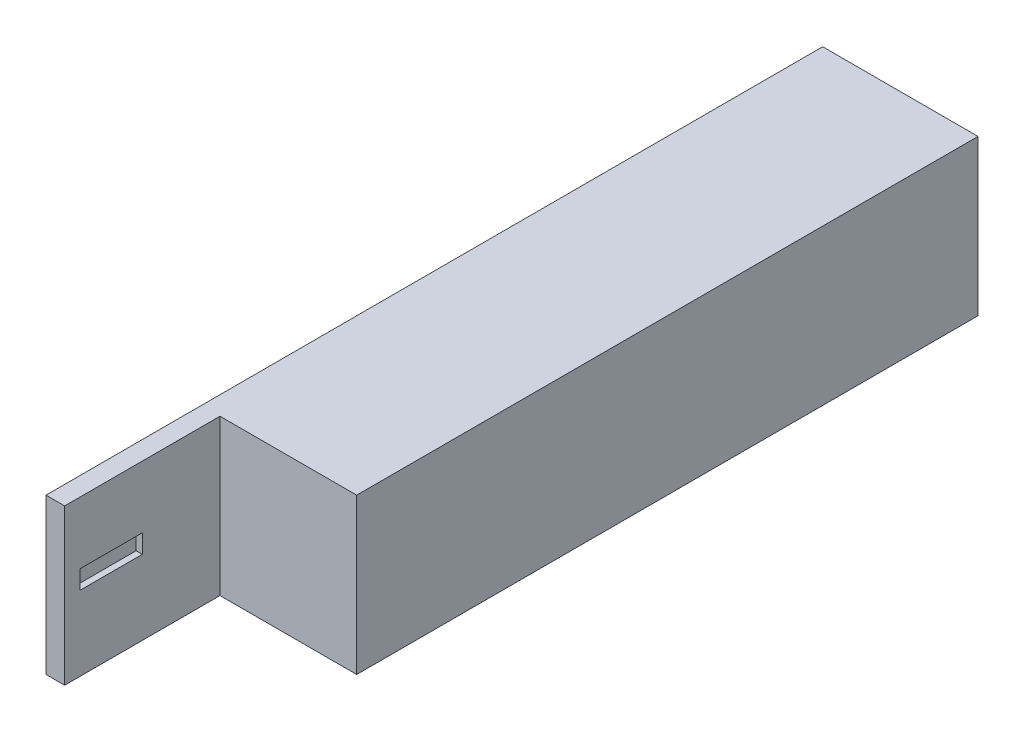
ISO-10303-21;
HEADER;
FILE_DESCRIPTION(('STEP AP214'),'2;1');
FILE_NAME('part.step','',(''),(''),'','','');
FILE_SCHEMA(('AUTOMOTIVE_DESIGN { 1 0 10303 214 1 1 1 1 }'));
ENDSEC;
DATA;
#1=APPLICATION_CONTEXT('core data for automotive mechanical design processes');
#2=APPLICATION_PROTOCOL_DEFINITION('international standard','automotive_design',2000,#1);
#3=PRODUCT_CONTEXT('',#1,'mechanical');
#4=PRODUCT('Part','Part','',(#3));
#5=PRODUCT_RELATED_PRODUCT_CATEGORY('part','',(#4));
#6=PRODUCT_DEFINITION_FORMATION('','',#4);
#7=PRODUCT_DEFINITION_CONTEXT('part definition',#1,'design');
#8=PRODUCT_DEFINITION('design','',#6,#7);
#9=PRODUCT_DEFINITION_SHAPE('','',#8);
#10=(LENGTH_UNIT() NAMED_UNIT(*) SI_UNIT(.MILLI.,.METRE.));
#11=(NAMED_UNIT(*) PLANE_ANGLE_UNIT() SI_UNIT($,.RADIAN.));
#12=(NAMED_UNIT(*) SI_UNIT($,.STERADIAN.) SOLID_ANGLE_UNIT());
#13=UNCERTAINTY_MEASURE_WITH_UNIT(LENGTH_MEASURE(1.E-05),#10,'distance_accuracy_value','');
#14=(GEOMETRIC_REPRESENTATION_CONTEXT(3) GLOBAL_UNCERTAINTY_ASSIGNED_CONTEXT((#13)) GLOBAL_UNIT_ASSIGNED_CONTEXT((#10,
#11,#12)) REPRESENTATION_CONTEXT('',''));
#15=CARTESIAN_POINT('',(0.,0.,0.));
#16=DIRECTION('',(0.,0.,1.));
#17=DIRECTION('',(1.,0.,0.));
#18=AXIS2_PLACEMENT_3D('',#15,#16,#17);
#19=CARTESIAN_POINT('',(0.,0.,200.));
#20=DIRECTION('',(1.,0.,0.));
#21=DIRECTION('',(0.,1.,0.));
#22=AXIS2_PLACEMENT_3D('',#19,#20,#21);
#23=PLANE('',#22);
#24=DIRECTION('',(0.,-1.,0.));
#25=VECTOR('',#24,1.);
#26=CARTESIAN_POINT('',(0.,0.,0.));
#27=LINE('',#26,#25);
#28=CARTESIAN_POINT('',(0.,0.,0.));
#29=VERTEX_POINT('',#28);
#30=CARTESIAN_POINT('',(0.,-50.,0.));
#31=VERTEX_POINT('',#30);
#32=EDGE_CURVE('E220',#29,#31,#27,.T.);
#33=ORIENTED_EDGE('',*,*,#32,.T.);
#34=DIRECTION('',(0.,0.,-1.));
#35=VECTOR('',#34,1.);
#36=CARTESIAN_POINT('',(0.,-50.,200.));
#37=LINE('',#36,#35);
#38=CARTESIAN_POINT('',(0.,-50.,250.));
#39=VERTEX_POINT('',#38);
#40=EDGE_CURVE('E11',#39,#31,#37,.T.);
#41=ORIENTED_EDGE('',*,*,#40,.F.);
#42=DIRECTION('',(0.,-1.,0.));
#43=VECTOR('',#42,1.);
#44=CARTESIAN_POINT('',(0.,0.,250.));
#45=LINE('',#44,#43);
#46=CARTESIAN_POINT('',(0.,0.,250.));
#47=VERTEX_POINT('',#46);
#48=EDGE_CURVE('E202',#47,#39,#45,.T.);
#49=ORIENTED_EDGE('',*,*,#48,.F.);
#50=DIRECTION('',(0.,0.,-1.));
#51=VECTOR('',#50,1.);
#52=CARTESIAN_POINT('',(0.,0.,200.));
#53=LINE('',#52,#51);
#54=EDGE_CURVE('E228',#47,#29,#53,.T.);
#55=ORIENTED_EDGE('',*,*,#54,.T.);
#56=EDGE_LOOP('',(#33,#41,#49,#55));
#57=FACE_BOUND('',#56,.T.);
#58=ADVANCED_FACE('F33',(#57),#23,.F.);
#59=CARTESIAN_POINT('',(0.,-50.,200.));
#60=DIRECTION('',(0.,1.,0.));
#61=DIRECTION('',(0.,0.,1.));
#62=AXIS2_PLACEMENT_3D('',#59,#60,#61);
#63=PLANE('',#62);
#64=DIRECTION('',(1.,0.,0.));
#65=VECTOR('',#64,1.);
#66=CARTESIAN_POINT('',(0.,-50.,0.));
#67=LINE('',#66,#65);
#68=CARTESIAN_POINT('',(50.,-50.,0.));
#69=VERTEX_POINT('',#68);
#70=EDGE_CURVE('E231',#31,#69,#67,.T.);
#71=ORIENTED_EDGE('',*,*,#70,.T.);
#72=DIRECTION('',(0.,0.,-1.));
#73=VECTOR('',#72,1.);
#74=CARTESIAN_POINT('',(50.,-50.,200.));
#75=LINE('',#74,#73);
#76=CARTESIAN_POINT('',(50.,-50.,200.));
#77=VERTEX_POINT('',#76);
#78=EDGE_CURVE('E40',#77,#69,#75,.T.);
#79=ORIENTED_EDGE('',*,*,#78,.F.);
#80=DIRECTION('',(1.,0.,0.));
#81=VECTOR('',#80,1.);
#82=CARTESIAN_POINT('',(0.,-50.,200.));
#83=LINE('',#82,#81);
#84=CARTESIAN_POINT('',(6.,-50.,200.));
#85=VERTEX_POINT('',#84);
#86=EDGE_CURVE('E221',#85,#77,#83,.T.);
#87=ORIENTED_EDGE('',*,*,#86,.F.);
#88=DIRECTION('',(0.,0.,-1.));
#89=VECTOR('',#88,1.);
#90=CARTESIAN_POINT('',(6.00000000000001,-50.,250.));
#91=LINE('',#90,#89);
#92=CARTESIAN_POINT('',(6.00000000000001,-50.,250.));
#93=VERTEX_POINT('',#92);
#94=EDGE_CURVE('E217',#93,#85,#91,.T.);
#95=ORIENTED_EDGE('',*,*,#94,.F.);
#96=DIRECTION('',(1.,0.,0.));
#97=VECTOR('',#96,1.);
#98=CARTESIAN_POINT('',(0.,-50.,250.));
#99=LINE('',#98,#97);
#100=EDGE_CURVE('E205',#39,#93,#99,.T.);
#101=ORIENTED_EDGE('',*,*,#100,.F.);
#102=ORIENTED_EDGE('',*,*,#40,.T.);
#103=EDGE_LOOP('',(#71,#79,#87,#95,#101,#102));
#104=FACE_BOUND('',#103,.T.);
#105=ADVANCED_FACE('F269',(#104),#63,.F.);
#106=CARTESIAN_POINT('',(50.,0.,200.));
#107=DIRECTION('',(-1.,0.,0.));
#108=DIRECTION('',(0.,0.,1.));
#109=AXIS2_PLACEMENT_3D('',#106,#107,#108);
#110=PLANE('',#109);
#111=DIRECTION('',(0.,1.,0.));
#112=VECTOR('',#111,1.);
#113=CARTESIAN_POINT('',(50.,0.,0.));
#114=LINE('',#113,#112);
#115=CARTESIAN_POINT('',(50.,0.,0.));
#116=VERTEX_POINT('',#115);
#117=EDGE_CURVE('E233',#69,#116,#114,.T.);
#118=ORIENTED_EDGE('',*,*,#117,.T.);
#119=DIRECTION('',(0.,0.,-1.));
#120=VECTOR('',#119,1.);
#121=CARTESIAN_POINT('',(50.,0.,200.));
#122=LINE('',#121,#120);
#123=CARTESIAN_POINT('',(50.,0.,200.));
#124=VERTEX_POINT('',#123);
#125=EDGE_CURVE('E238',#124,#116,#122,.T.);
#126=ORIENTED_EDGE('',*,*,#125,.F.);
#127=DIRECTION('',(0.,1.,0.));
#128=VECTOR('',#127,1.);
#129=CARTESIAN_POINT('',(50.,0.,200.));
#130=LINE('',#129,#128);
#131=EDGE_CURVE('E223',#77,#124,#130,.T.);
#132=ORIENTED_EDGE('',*,*,#131,.F.);
#133=ORIENTED_EDGE('',*,*,#78,.T.);
#134=EDGE_LOOP('',(#118,#126,#132,#133));
#135=FACE_BOUND('',#134,.T.);
#136=ADVANCED_FACE('F245',(#135),#110,.F.);
#137=CARTESIAN_POINT('',(0.,0.,200.));
#138=DIRECTION('',(0.,-1.,0.));
#139=DIRECTION('',(0.,0.,-1.));
#140=AXIS2_PLACEMENT_3D('',#137,#138,#139);
#141=PLANE('',#140);
#142=DIRECTION('',(-1.,0.,0.));
#143=VECTOR('',#142,1.);
#144=CARTESIAN_POINT('',(0.,0.,0.));
#145=LINE('',#144,#143);
#146=EDGE_CURVE('E224',#116,#29,#145,.T.);
#147=ORIENTED_EDGE('',*,*,#146,.T.);
#148=ORIENTED_EDGE('',*,*,#54,.F.);
#149=DIRECTION('',(-1.,0.,0.));
#150=VECTOR('',#149,1.);
#151=CARTESIAN_POINT('',(0.,0.,250.));
#152=LINE('',#151,#150);
#153=CARTESIAN_POINT('',(6.,0.,250.));
#154=VERTEX_POINT('',#153);
#155=EDGE_CURVE('E209',#154,#47,#152,.T.);
#156=ORIENTED_EDGE('',*,*,#155,.F.);
#157=DIRECTION('',(0.,0.,-1.));
#158=VECTOR('',#157,1.);
#159=CARTESIAN_POINT('',(6.,0.,250.));
#160=LINE('',#159,#158);
#161=CARTESIAN_POINT('',(6.,0.,200.));
#162=VERTEX_POINT('',#161);
#163=EDGE_CURVE('E212',#154,#162,#160,.T.);
#164=ORIENTED_EDGE('',*,*,#163,.T.);
#165=DIRECTION('',(-1.,0.,0.));
#166=VECTOR('',#165,1.);
#167=CARTESIAN_POINT('',(0.,0.,200.));
#168=LINE('',#167,#166);
#169=EDGE_CURVE('E226',#124,#162,#168,.T.);
#170=ORIENTED_EDGE('',*,*,#169,.F.);
#171=ORIENTED_EDGE('',*,*,#125,.T.);
#172=EDGE_LOOP('',(#147,#148,#156,#164,#170,#171));
#173=FACE_BOUND('',#172,.T.);
#174=ADVANCED_FACE('F254',(#173),#141,.F.);
#175=CARTESIAN_POINT('',(0.,0.,200.));
#176=DIRECTION('',(0.,0.,1.));
#177=DIRECTION('',(1.,0.,0.));
#178=AXIS2_PLACEMENT_3D('',#175,#176,#177);
#179=PLANE('',#178);
#180=DIRECTION('',(0.,1.,0.));
#181=VECTOR('',#180,1.);
#182=CARTESIAN_POINT('',(6.,0.,200.));
#183=LINE('',#182,#181);
#184=EDGE_CURVE('E196',#85,#162,#183,.T.);
#185=ORIENTED_EDGE('',*,*,#184,.F.);
#186=ORIENTED_EDGE('',*,*,#86,.T.);
#187=ORIENTED_EDGE('',*,*,#131,.T.);
#188=ORIENTED_EDGE('',*,*,#169,.T.);
#189=EDGE_LOOP('',(#185,#186,#187,#188));
#190=FACE_BOUND('',#189,.T.);
#191=ADVANCED_FACE('F268',(#190),#179,.T.);
#192=CARTESIAN_POINT('',(0.,0.,0.));
#193=DIRECTION('',(0.,0.,1.));
#194=DIRECTION('',(1.,0.,0.));
#195=AXIS2_PLACEMENT_3D('',#192,#193,#194);
#196=PLANE('',#195);
#197=DIRECTION('',(0.,-1.,0.));
#198=VECTOR('',#197,1.);
#199=CARTESIAN_POINT('',(13.685,0.,0.));
#200=LINE('',#199,#198);
#201=CARTESIAN_POINT('',(13.685,-18.905,0.));
#202=VERTEX_POINT('',#201);
#203=CARTESIAN_POINT('',(13.685,-31.095,0.));
#204=VERTEX_POINT('',#203);
#205=EDGE_CURVE('E162',#202,#204,#200,.T.);
#206=ORIENTED_EDGE('',*,*,#205,.T.);
#207=DIRECTION('',(-1.,0.,0.));
#208=VECTOR('',#207,1.);
#209=CARTESIAN_POINT('',(0.,-31.095,0.));
#210=LINE('',#209,#208);
#211=CARTESIAN_POINT('',(36.315,-31.095,0.));
#212=VERTEX_POINT('',#211);
#213=EDGE_CURVE('E47',#212,#204,#210,.T.);
#214=ORIENTED_EDGE('',*,*,#213,.F.);
#215=DIRECTION('',(0.,-1.,0.));
#216=VECTOR('',#215,1.);
#217=CARTESIAN_POINT('',(36.315,0.,0.));
#218=LINE('',#217,#216);
#219=CARTESIAN_POINT('',(36.315,-18.905,0.));
#220=VERTEX_POINT('',#219);
#221=EDGE_CURVE('E153',#220,#212,#218,.T.);
#222=ORIENTED_EDGE('',*,*,#221,.F.);
#223=DIRECTION('',(-1.,0.,0.));
#224=VECTOR('',#223,1.);
#225=CARTESIAN_POINT('',(0.,-18.905,0.));
#226=LINE('',#225,#224);
#227=EDGE_CURVE('E156',#220,#202,#226,.T.);
#228=ORIENTED_EDGE('',*,*,#227,.T.);
#229=EDGE_LOOP('',(#206,#214,#222,#228));
#230=FACE_BOUND('',#229,.T.);
#231=ORIENTED_EDGE('',*,*,#32,.F.);
#232=ORIENTED_EDGE('',*,*,#146,.F.);
#233=ORIENTED_EDGE('',*,*,#117,.F.);
#234=ORIENTED_EDGE('',*,*,#70,.F.);
#235=EDGE_LOOP('',(#231,#232,#233,#234));
#236=FACE_BOUND('',#235,.T.);
#237=ADVANCED_FACE('F252',(#230,#236),#196,.F.);
#238=CARTESIAN_POINT('',(6.,0.,250.));
#239=DIRECTION('',(-1.,0.,0.));
#240=DIRECTION('',(0.,-1.,0.));
#241=AXIS2_PLACEMENT_3D('',#238,#239,#240);
#242=PLANE('',#241);
#243=DIRECTION('',(0.,0.,-1.));
#244=VECTOR('',#243,1.);
#245=CARTESIAN_POINT('',(6.,-26.,245.));
#246=LINE('',#245,#244);
#247=CARTESIAN_POINT('',(6.,-26.,245.));
#248=VERTEX_POINT('',#247);
#249=CARTESIAN_POINT('',(6.,-26.,225.));
#250=VERTEX_POINT('',#249);
#251=EDGE_CURVE('E186',#248,#250,#246,.T.);
#252=ORIENTED_EDGE('',*,*,#251,.F.);
#253=DIRECTION('',(0.,-1.,0.));
#254=VECTOR('',#253,1.);
#255=CARTESIAN_POINT('',(6.,-20.,245.));
#256=LINE('',#255,#254);
#257=CARTESIAN_POINT('',(6.,-20.,245.));
#258=VERTEX_POINT('',#257);
#259=EDGE_CURVE('E55',#258,#248,#256,.T.);
#260=ORIENTED_EDGE('',*,*,#259,.F.);
#261=DIRECTION('',(0.,0.,1.));
#262=VECTOR('',#261,1.);
#263=CARTESIAN_POINT('',(6.,-20.,245.));
#264=LINE('',#263,#262);
#265=CARTESIAN_POINT('',(6.,-20.,225.));
#266=VERTEX_POINT('',#265);
#267=EDGE_CURVE('E175',#266,#258,#264,.T.);
#268=ORIENTED_EDGE('',*,*,#267,.F.);
#269=DIRECTION('',(0.,1.,0.));
#270=VECTOR('',#269,1.);
#271=CARTESIAN_POINT('',(6.,-20.,225.));
#272=LINE('',#271,#270);
#273=EDGE_CURVE('E189',#250,#266,#272,.T.);
#274=ORIENTED_EDGE('',*,*,#273,.F.);
#275=EDGE_LOOP('',(#252,#260,#268,#274));
#276=FACE_BOUND('',#275,.T.);
#277=ORIENTED_EDGE('',*,*,#184,.T.);
#278=ORIENTED_EDGE('',*,*,#163,.F.);
#279=DIRECTION('',(0.,1.,0.));
#280=VECTOR('',#279,1.);
#281=CARTESIAN_POINT('',(6.,0.,250.));
#282=LINE('',#281,#280);
#283=EDGE_CURVE('E207',#93,#154,#282,.T.);
#284=ORIENTED_EDGE('',*,*,#283,.F.);
#285=ORIENTED_EDGE('',*,*,#94,.T.);
#286=EDGE_LOOP('',(#277,#278,#284,#285));
#287=FACE_BOUND('',#286,.T.);
#288=ADVANCED_FACE('F266',(#276,#287),#242,.F.);
#289=CARTESIAN_POINT('',(0.,0.,250.));
#290=DIRECTION('',(0.,0.,1.));
#291=DIRECTION('',(1.,0.,0.));
#292=AXIS2_PLACEMENT_3D('',#289,#290,#291);
#293=PLANE('',#292);
#294=ORIENTED_EDGE('',*,*,#48,.T.);
#295=ORIENTED_EDGE('',*,*,#100,.T.);
#296=ORIENTED_EDGE('',*,*,#283,.T.);
#297=ORIENTED_EDGE('',*,*,#155,.T.);
#298=EDGE_LOOP('',(#294,#295,#296,#297));
#299=FACE_BOUND('',#298,.T.);
#300=ADVANCED_FACE('F261',(#299),#293,.T.);
#301=CARTESIAN_POINT('',(4.,-20.,245.));
#302=DIRECTION('',(0.,0.,1.));
#303=DIRECTION('',(1.,0.,0.));
#304=AXIS2_PLACEMENT_3D('',#301,#302,#303);
#305=PLANE('',#304);
#306=ORIENTED_EDGE('',*,*,#259,.T.);
#307=DIRECTION('',(1.,0.,0.));
#308=VECTOR('',#307,1.);
#309=CARTESIAN_POINT('',(4.,-26.,245.));
#310=LINE('',#309,#308);
#311=CARTESIAN_POINT('',(4.,-26.,245.));
#312=VERTEX_POINT('',#311);
#313=EDGE_CURVE('E184',#312,#248,#310,.T.);
#314=ORIENTED_EDGE('',*,*,#313,.F.);
#315=DIRECTION('',(0.,-1.,0.));
#316=VECTOR('',#315,1.);
#317=CARTESIAN_POINT('',(4.,-20.,245.));
#318=LINE('',#317,#316);
#319=CARTESIAN_POINT('',(4.,-20.,245.));
#320=VERTEX_POINT('',#319);
#321=EDGE_CURVE('E171',#320,#312,#318,.T.);
#322=ORIENTED_EDGE('',*,*,#321,.F.);
#323=DIRECTION('',(1.,0.,0.));
#324=VECTOR('',#323,1.);
#325=CARTESIAN_POINT('',(4.,-20.,245.));
#326=LINE('',#325,#324);
#327=EDGE_CURVE('E194',#320,#258,#326,.T.);
#328=ORIENTED_EDGE('',*,*,#327,.T.);
#329=EDGE_LOOP('',(#306,#314,#322,#328));
#330=FACE_BOUND('',#329,.T.);
#331=ADVANCED_FACE('F289',(#330),#305,.F.);
#332=CARTESIAN_POINT('',(4.,-20.,245.));
#333=DIRECTION('',(0.,1.,0.));
#334=DIRECTION('',(0.,0.,1.));
#335=AXIS2_PLACEMENT_3D('',#332,#333,#334);
#336=PLANE('',#335);
#337=ORIENTED_EDGE('',*,*,#267,.T.);
#338=ORIENTED_EDGE('',*,*,#327,.F.);
#339=DIRECTION('',(0.,0.,1.));
#340=VECTOR('',#339,1.);
#341=CARTESIAN_POINT('',(4.,-20.,245.));
#342=LINE('',#341,#340);
#343=CARTESIAN_POINT('',(4.,-20.,225.));
#344=VERTEX_POINT('',#343);
#345=EDGE_CURVE('E181',#344,#320,#342,.T.);
#346=ORIENTED_EDGE('',*,*,#345,.F.);
#347=DIRECTION('',(1.,0.,0.));
#348=VECTOR('',#347,1.);
#349=CARTESIAN_POINT('',(4.,-20.,225.));
#350=LINE('',#349,#348);
#351=EDGE_CURVE('E197',#344,#266,#350,.T.);
#352=ORIENTED_EDGE('',*,*,#351,.T.);
#353=EDGE_LOOP('',(#337,#338,#346,#352));
#354=FACE_BOUND('',#353,.T.);
#355=ADVANCED_FACE('F292',(#354),#336,.F.);
#356=CARTESIAN_POINT('',(4.,-20.,225.));
#357=DIRECTION('',(0.,0.,-1.));
#358=DIRECTION('',(-1.,0.,0.));
#359=AXIS2_PLACEMENT_3D('',#356,#357,#358);
#360=PLANE('',#359);
#361=ORIENTED_EDGE('',*,*,#273,.T.);
#362=ORIENTED_EDGE('',*,*,#351,.F.);
#363=DIRECTION('',(0.,1.,0.));
#364=VECTOR('',#363,1.);
#365=CARTESIAN_POINT('',(4.,-20.,225.));
#366=LINE('',#365,#364);
#367=CARTESIAN_POINT('',(4.,-26.,225.));
#368=VERTEX_POINT('',#367);
#369=EDGE_CURVE('E178',#368,#344,#366,.T.);
#370=ORIENTED_EDGE('',*,*,#369,.F.);
#371=DIRECTION('',(1.,0.,0.));
#372=VECTOR('',#371,1.);
#373=CARTESIAN_POINT('',(4.,-26.,225.));
#374=LINE('',#373,#372);
#375=EDGE_CURVE('E199',#368,#250,#374,.T.);
#376=ORIENTED_EDGE('',*,*,#375,.T.);
#377=EDGE_LOOP('',(#361,#362,#370,#376));
#378=FACE_BOUND('',#377,.T.);
#379=ADVANCED_FACE('F297',(#378),#360,.F.);
#380=CARTESIAN_POINT('',(4.,-26.,245.));
#381=DIRECTION('',(0.,-1.,0.));
#382=DIRECTION('',(1.,0.,0.));
#383=AXIS2_PLACEMENT_3D('',#380,#381,#382);
#384=PLANE('',#383);
#385=ORIENTED_EDGE('',*,*,#251,.T.);
#386=ORIENTED_EDGE('',*,*,#375,.F.);
#387=DIRECTION('',(0.,0.,-1.));
#388=VECTOR('',#387,1.);
#389=CARTESIAN_POINT('',(4.,-26.,245.));
#390=LINE('',#389,#388);
#391=EDGE_CURVE('E174',#312,#368,#390,.T.);
#392=ORIENTED_EDGE('',*,*,#391,.F.);
#393=ORIENTED_EDGE('',*,*,#313,.T.);
#394=EDGE_LOOP('',(#385,#386,#392,#393));
#395=FACE_BOUND('',#394,.T.);
#396=ADVANCED_FACE('F293',(#395),#384,.F.);
#397=CARTESIAN_POINT('',(4.,0.,0.));
#398=DIRECTION('',(1.,0.,0.));
#399=DIRECTION('',(0.,0.,-1.));
#400=AXIS2_PLACEMENT_3D('',#397,#398,#399);
#401=PLANE('',#400);
#402=ORIENTED_EDGE('',*,*,#321,.T.);
#403=ORIENTED_EDGE('',*,*,#391,.T.);
#404=ORIENTED_EDGE('',*,*,#369,.T.);
#405=ORIENTED_EDGE('',*,*,#345,.T.);
#406=EDGE_LOOP('',(#402,#403,#404,#405));
#407=FACE_BOUND('',#406,.T.);
#408=ADVANCED_FACE('F296',(#407),#401,.T.);
#409=CARTESIAN_POINT('',(0.,-31.095,10.84));
#410=DIRECTION('',(0.,-1.,0.));
#411=DIRECTION('',(1.,0.,0.));
#412=AXIS2_PLACEMENT_3D('',#409,#410,#411);
#413=PLANE('',#412);
#414=ORIENTED_EDGE('',*,*,#213,.T.);
#415=DIRECTION('',(0.,0.,-1.));
#416=VECTOR('',#415,1.);
#417=CARTESIAN_POINT('',(13.685,-31.095,10.84));
#418=LINE('',#417,#416);
#419=CARTESIAN_POINT('',(13.685,-31.095,10.84));
#420=VERTEX_POINT('',#419);
#421=EDGE_CURVE('E137',#420,#204,#418,.T.);
#422=ORIENTED_EDGE('',*,*,#421,.F.);
#423=DIRECTION('',(-1.,0.,0.));
#424=VECTOR('',#423,1.);
#425=CARTESIAN_POINT('',(0.,-31.095,10.84));
#426=LINE('',#425,#424);
#427=CARTESIAN_POINT('',(36.315,-31.095,10.84));
#428=VERTEX_POINT('',#427);
#429=EDGE_CURVE('E144',#428,#420,#426,.T.);
#430=ORIENTED_EDGE('',*,*,#429,.F.);
#431=DIRECTION('',(0.,0.,-1.));
#432=VECTOR('',#431,1.);
#433=CARTESIAN_POINT('',(36.315,-31.095,10.84));
#434=LINE('',#433,#432);
#435=EDGE_CURVE('E166',#428,#212,#434,.T.);
#436=ORIENTED_EDGE('',*,*,#435,.T.);
#437=EDGE_LOOP('',(#414,#422,#430,#436));
#438=FACE_BOUND('',#437,.T.);
#439=ADVANCED_FACE('F147',(#438),#413,.F.);
#440=CARTESIAN_POINT('',(36.315,0.,10.84));
#441=DIRECTION('',(1.,0.,0.));
#442=DIRECTION('',(0.,0.,-1.));
#443=AXIS2_PLACEMENT_3D('',#440,#441,#442);
#444=PLANE('',#443);
#445=ORIENTED_EDGE('',*,*,#221,.T.);
#446=ORIENTED_EDGE('',*,*,#435,.F.);
#447=DIRECTION('',(0.,-1.,0.));
#448=VECTOR('',#447,1.);
#449=CARTESIAN_POINT('',(36.315,0.,10.84));
#450=LINE('',#449,#448);
#451=CARTESIAN_POINT('',(36.315,-18.905,10.84));
#452=VERTEX_POINT('',#451);
#453=EDGE_CURVE('E149',#452,#428,#450,.T.);
#454=ORIENTED_EDGE('',*,*,#453,.F.);
#455=DIRECTION('',(0.,0.,-1.));
#456=VECTOR('',#455,1.);
#457=CARTESIAN_POINT('',(36.315,-18.905,10.84));
#458=LINE('',#457,#456);
#459=EDGE_CURVE('E168',#452,#220,#458,.T.);
#460=ORIENTED_EDGE('',*,*,#459,.T.);
#461=EDGE_LOOP('',(#445,#446,#454,#460));
#462=FACE_BOUND('',#461,.T.);
#463=ADVANCED_FACE('F310',(#462),#444,.F.);
#464=CARTESIAN_POINT('',(0.,-18.905,10.84));
#465=DIRECTION('',(0.,-1.,0.));
#466=DIRECTION('',(1.,0.,0.));
#467=AXIS2_PLACEMENT_3D('',#464,#465,#466);
#468=PLANE('',#467);
#469=ORIENTED_EDGE('',*,*,#227,.F.);
#470=ORIENTED_EDGE('',*,*,#459,.F.);
#471=DIRECTION('',(-1.,0.,0.));
#472=VECTOR('',#471,1.);
#473=CARTESIAN_POINT('',(0.,-18.905,10.84));
#474=LINE('',#473,#472);
#475=CARTESIAN_POINT('',(13.685,-18.905,10.84));
#476=VERTEX_POINT('',#475);
#477=EDGE_CURVE('E143',#452,#476,#474,.T.);
#478=ORIENTED_EDGE('',*,*,#477,.T.);
#479=DIRECTION('',(0.,0.,-1.));
#480=VECTOR('',#479,1.);
#481=CARTESIAN_POINT('',(13.685,-18.905,10.84));
#482=LINE('',#481,#480);
#483=EDGE_CURVE('E139',#476,#202,#482,.T.);
#484=ORIENTED_EDGE('',*,*,#483,.T.);
#485=EDGE_LOOP('',(#469,#470,#478,#484));
#486=FACE_BOUND('',#485,.T.);
#487=ADVANCED_FACE('F313',(#486),#468,.T.);
#488=CARTESIAN_POINT('',(13.685,0.,10.84));
#489=DIRECTION('',(1.,0.,0.));
#490=DIRECTION('',(0.,0.,-1.));
#491=AXIS2_PLACEMENT_3D('',#488,#489,#490);
#492=PLANE('',#491);
#493=ORIENTED_EDGE('',*,*,#205,.F.);
#494=ORIENTED_EDGE('',*,*,#483,.F.);
#495=DIRECTION('',(0.,-1.,0.));
#496=VECTOR('',#495,1.);
#497=CARTESIAN_POINT('',(13.685,0.,10.84));
#498=LINE('',#497,#496);
#499=EDGE_CURVE('E134',#476,#420,#498,.T.);
#500=ORIENTED_EDGE('',*,*,#499,.T.);
#501=ORIENTED_EDGE('',*,*,#421,.T.);
#502=EDGE_LOOP('',(#493,#494,#500,#501));
#503=FACE_BOUND('',#502,.T.);
#504=ADVANCED_FACE('F136',(#503),#492,.T.);
#505=CARTESIAN_POINT('',(0.,0.,10.84));
#506=DIRECTION('',(0.,0.,-1.));
#507=DIRECTION('',(-1.,0.,0.));
#508=AXIS2_PLACEMENT_3D('',#505,#506,#507);
#509=PLANE('',#508);
#510=ORIENTED_EDGE('',*,*,#429,.T.);
#511=ORIENTED_EDGE('',*,*,#499,.F.);
#512=ORIENTED_EDGE('',*,*,#477,.F.);
#513=ORIENTED_EDGE('',*,*,#453,.T.);
#514=EDGE_LOOP('',(#510,#511,#512,#513));
#515=FACE_BOUND('',#514,.T.);
#516=ADVANCED_FACE('F151',(#515),#509,.T.);
#517=CLOSED_SHELL('',(#58,#105,#136,#174,#191,#237,#288,#300,#331,#355,#379,#396,#408,#439,#463,
#487,#504,#516));
#518=MANIFOLD_SOLID_BREP('B2',#517);
#519=ADVANCED_BREP_SHAPE_REPRESENTATION('',(#18,#518),#14);
#520=SHAPE_DEFINITION_REPRESENTATION(#9,#519);
ENDSEC;
END-ISO-10303-21;
